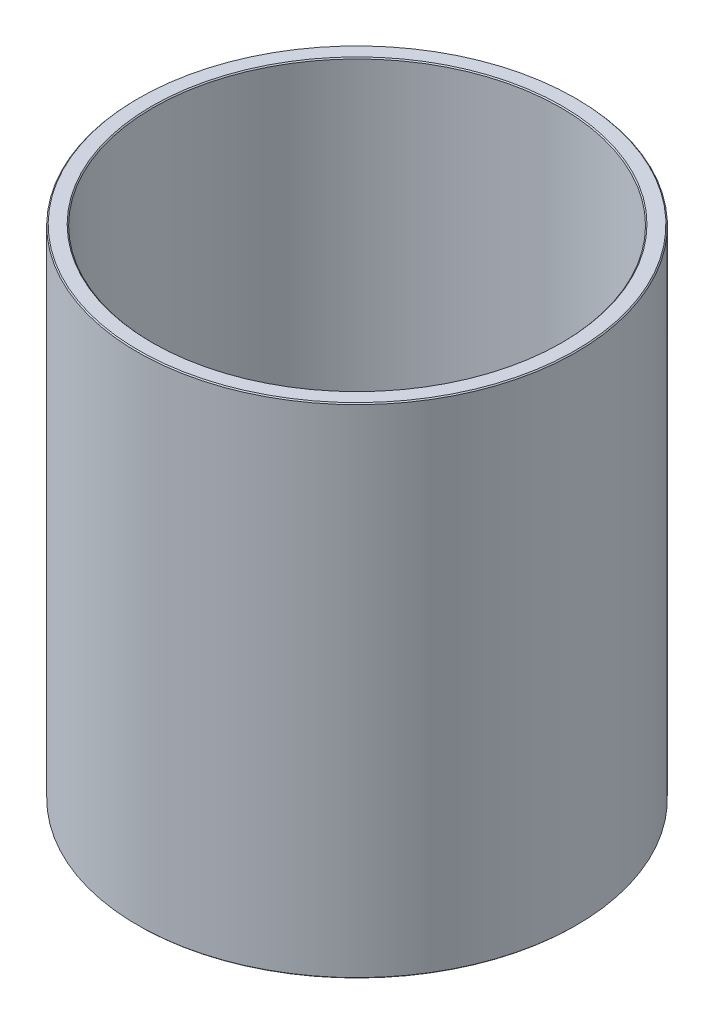
ISO-10303-21;
HEADER;
FILE_DESCRIPTION(('STEP AP214'),'2;1');
FILE_NAME('part.step','',(''),(''),'','','');
FILE_SCHEMA(('AUTOMOTIVE_DESIGN { 1 0 10303 214 1 1 1 1 }'));
ENDSEC;
DATA;
#1=APPLICATION_CONTEXT('core data for automotive mechanical design processes');
#2=APPLICATION_PROTOCOL_DEFINITION('international standard','automotive_design',2000,#1);
#3=PRODUCT_CONTEXT('',#1,'mechanical');
#4=PRODUCT('Part','Part','',(#3));
#5=PRODUCT_RELATED_PRODUCT_CATEGORY('part','',(#4));
#6=PRODUCT_DEFINITION_FORMATION('','',#4);
#7=PRODUCT_DEFINITION_CONTEXT('part definition',#1,'design');
#8=PRODUCT_DEFINITION('design','',#6,#7);
#9=PRODUCT_DEFINITION_SHAPE('','',#8);
#10=(LENGTH_UNIT() NAMED_UNIT(*) SI_UNIT(.MILLI.,.METRE.));
#11=(NAMED_UNIT(*) PLANE_ANGLE_UNIT() SI_UNIT($,.RADIAN.));
#12=(NAMED_UNIT(*) SI_UNIT($,.STERADIAN.) SOLID_ANGLE_UNIT());
#13=UNCERTAINTY_MEASURE_WITH_UNIT(LENGTH_MEASURE(1.E-05),#10,'distance_accuracy_value','');
#14=(GEOMETRIC_REPRESENTATION_CONTEXT(3) GLOBAL_UNCERTAINTY_ASSIGNED_CONTEXT((#13)) GLOBAL_UNIT_ASSIGNED_CONTEXT((#10,
#11,#12)) REPRESENTATION_CONTEXT('',''));
#15=CARTESIAN_POINT('',(0.,0.,0.));
#16=DIRECTION('',(0.,0.,1.));
#17=DIRECTION('',(1.,0.,0.));
#18=AXIS2_PLACEMENT_3D('',#15,#16,#17);
#19=CARTESIAN_POINT('',(39.5,0.,0.));
#20=DIRECTION('',(0.,-1.,0.));
#21=DIRECTION('',(0.,0.,-1.));
#22=AXIS2_PLACEMENT_3D('',#19,#20,#21);
#23=PLANE('',#22);
#24=CARTESIAN_POINT('',(0.,0.,0.));
#25=DIRECTION('',(0.,-1.,0.));
#26=DIRECTION('',(0.,0.,-1.));
#27=AXIS2_PLACEMENT_3D('',#24,#25,#26);
#28=CIRCLE('',#27,39.7);
#29=CARTESIAN_POINT('',(0.,0.,-39.7));
#30=VERTEX_POINT('',#29);
#31=EDGE_CURVE('E62',#30,#30,#28,.F.);
#32=ORIENTED_EDGE('',*,*,#31,.T.);
#33=EDGE_LOOP('',(#32));
#34=FACE_BOUND('',#33,.T.);
#35=CARTESIAN_POINT('',(0.,0.,0.));
#36=DIRECTION('',(0.,-1.,0.));
#37=DIRECTION('',(0.,0.,-1.));
#38=AXIS2_PLACEMENT_3D('',#35,#36,#37);
#39=CIRCLE('',#38,42.3);
#40=CARTESIAN_POINT('',(0.,0.,-42.3));
#41=VERTEX_POINT('',#40);
#42=EDGE_CURVE('E65',#41,#41,#39,.T.);
#43=ORIENTED_EDGE('',*,*,#42,.T.);
#44=EDGE_LOOP('',(#43));
#45=FACE_BOUND('',#44,.T.);
#46=ADVANCED_FACE('F41',(#34,#45),#23,.T.);
#47=CARTESIAN_POINT('',(0.,0.,0.));
#48=DIRECTION('',(0.,-1.,0.));
#49=DIRECTION('',(0.,0.,-1.));
#50=AXIS2_PLACEMENT_3D('',#47,#48,#49);
#51=CYLINDRICAL_SURFACE('',#50,42.5);
#52=CARTESIAN_POINT('',(0.,0.199999999999992,0.));
#53=DIRECTION('',(0.,-1.,0.));
#54=DIRECTION('',(0.,0.,-1.));
#55=AXIS2_PLACEMENT_3D('',#52,#53,#54);
#56=CIRCLE('',#55,42.5);
#57=CARTESIAN_POINT('',(0.,0.199999999999992,-42.5));
#58=VERTEX_POINT('',#57);
#59=EDGE_CURVE('E53',#58,#58,#56,.F.);
#60=ORIENTED_EDGE('',*,*,#59,.T.);
#61=EDGE_LOOP('',(#60));
#62=FACE_BOUND('',#61,.T.);
#63=CARTESIAN_POINT('',(0.,96.3000000000001,0.));
#64=DIRECTION('',(0.,1.,0.));
#65=DIRECTION('',(0.,0.,1.));
#66=AXIS2_PLACEMENT_3D('',#63,#64,#65);
#67=CIRCLE('',#66,42.5);
#68=CARTESIAN_POINT('',(0.,96.3000000000001,-42.5));
#69=VERTEX_POINT('',#68);
#70=EDGE_CURVE('E57',#69,#69,#67,.F.);
#71=ORIENTED_EDGE('',*,*,#70,.T.);
#72=EDGE_LOOP('',(#71));
#73=FACE_BOUND('',#72,.T.);
#74=ADVANCED_FACE('F91',(#62,#73),#51,.T.);
#75=CARTESIAN_POINT('',(42.5,96.5,0.));
#76=DIRECTION('',(0.,1.,0.));
#77=DIRECTION('',(0.,0.,1.));
#78=AXIS2_PLACEMENT_3D('',#75,#76,#77);
#79=PLANE('',#78);
#80=CARTESIAN_POINT('',(0.,96.5,0.));
#81=DIRECTION('',(0.,1.,0.));
#82=DIRECTION('',(0.,0.,1.));
#83=AXIS2_PLACEMENT_3D('',#80,#81,#82);
#84=CIRCLE('',#83,39.7);
#85=CARTESIAN_POINT('',(0.,96.5,39.7));
#86=VERTEX_POINT('',#85);
#87=EDGE_CURVE('E10',#86,#86,#84,.F.);
#88=ORIENTED_EDGE('',*,*,#87,.T.);
#89=EDGE_LOOP('',(#88));
#90=FACE_BOUND('',#89,.T.);
#91=CARTESIAN_POINT('',(0.,96.5,0.));
#92=DIRECTION('',(0.,1.,0.));
#93=DIRECTION('',(0.,0.,1.));
#94=AXIS2_PLACEMENT_3D('',#91,#92,#93);
#95=CIRCLE('',#94,42.3);
#96=CARTESIAN_POINT('',(0.,96.5,-42.3));
#97=VERTEX_POINT('',#96);
#98=EDGE_CURVE('E49',#97,#97,#95,.T.);
#99=ORIENTED_EDGE('',*,*,#98,.T.);
#100=EDGE_LOOP('',(#99));
#101=FACE_BOUND('',#100,.T.);
#102=ADVANCED_FACE('F97',(#90,#101),#79,.T.);
#103=CARTESIAN_POINT('',(0.,0.,0.));
#104=DIRECTION('',(0.,-1.,0.));
#105=DIRECTION('',(0.,0.,-1.));
#106=AXIS2_PLACEMENT_3D('',#103,#104,#105);
#107=CYLINDRICAL_SURFACE('',#106,39.5);
#108=CARTESIAN_POINT('',(0.,0.20000000000004,0.));
#109=DIRECTION('',(0.,-1.,0.));
#110=DIRECTION('',(0.,0.,-1.));
#111=AXIS2_PLACEMENT_3D('',#108,#109,#110);
#112=CIRCLE('',#111,39.5);
#113=CARTESIAN_POINT('',(0.,0.20000000000004,-39.5));
#114=VERTEX_POINT('',#113);
#115=EDGE_CURVE('E68',#114,#114,#112,.T.);
#116=ORIENTED_EDGE('',*,*,#115,.T.);
#117=EDGE_LOOP('',(#116));
#118=FACE_BOUND('',#117,.T.);
#119=CARTESIAN_POINT('',(0.,96.3,0.));
#120=DIRECTION('',(0.,1.,0.));
#121=DIRECTION('',(0.,0.,1.));
#122=AXIS2_PLACEMENT_3D('',#119,#120,#121);
#123=CIRCLE('',#122,39.5);
#124=CARTESIAN_POINT('',(0.,96.3,39.5));
#125=VERTEX_POINT('',#124);
#126=EDGE_CURVE('E71',#125,#125,#123,.T.);
#127=ORIENTED_EDGE('',*,*,#126,.T.);
#128=EDGE_LOOP('',(#127));
#129=FACE_BOUND('',#128,.T.);
#130=ADVANCED_FACE('F75',(#118,#129),#107,.F.);
#131=CARTESIAN_POINT('',(0.,0.20000000000004,0.));
#132=DIRECTION('',(0.,-1.,0.));
#133=DIRECTION('',(0.,0.,-1.));
#134=AXIS2_PLACEMENT_3D('',#131,#132,#133);
#135=CONICAL_SURFACE('',#134,39.5,0.785398163397466);
#136=ORIENTED_EDGE('',*,*,#31,.F.);
#137=EDGE_LOOP('',(#136));
#138=FACE_BOUND('',#137,.T.);
#139=ORIENTED_EDGE('',*,*,#115,.F.);
#140=EDGE_LOOP('',(#139));
#141=FACE_BOUND('',#140,.T.);
#142=ADVANCED_FACE('F86',(#138,#141),#135,.F.);
#143=CARTESIAN_POINT('',(0.,0.,0.));
#144=DIRECTION('',(0.,1.,0.));
#145=DIRECTION('',(0.,0.,1.));
#146=AXIS2_PLACEMENT_3D('',#143,#144,#145);
#147=CONICAL_SURFACE('',#146,42.3,0.785398163397431);
#148=ORIENTED_EDGE('',*,*,#59,.F.);
#149=EDGE_LOOP('',(#148));
#150=FACE_BOUND('',#149,.T.);
#151=ORIENTED_EDGE('',*,*,#42,.F.);
#152=EDGE_LOOP('',(#151));
#153=FACE_BOUND('',#152,.T.);
#154=ADVANCED_FACE('F80',(#150,#153),#147,.T.);
#155=CARTESIAN_POINT('',(0.,96.5,0.));
#156=DIRECTION('',(0.,1.,0.));
#157=DIRECTION('',(0.,0.,1.));
#158=AXIS2_PLACEMENT_3D('',#155,#156,#157);
#159=CONICAL_SURFACE('',#158,39.7,0.785398163397483);
#160=CARTESIAN_POINT('',(0.,96.3,39.5));
#161=CARTESIAN_POINT('',(0.,96.3020833333333,39.5020833333333));
#162=CARTESIAN_POINT('',(0.,96.3041666666667,39.5041666666667));
#163=CARTESIAN_POINT('',(0.,96.3083333333333,39.5083333333333));
#164=CARTESIAN_POINT('',(0.,96.3104166666667,39.5104166666667));
#165=CARTESIAN_POINT('',(0.,96.3145833333333,39.5145833333333));
#166=CARTESIAN_POINT('',(0.,96.3166666666667,39.5166666666667));
#167=CARTESIAN_POINT('',(0.,96.3208333333333,39.5208333333333));
#168=CARTESIAN_POINT('',(0.,96.3229166666667,39.5229166666667));
#169=CARTESIAN_POINT('',(0.,96.3270833333333,39.5270833333333));
#170=CARTESIAN_POINT('',(0.,96.3291666666667,39.5291666666666));
#171=CARTESIAN_POINT('',(0.,96.3333333333333,39.5333333333333));
#172=CARTESIAN_POINT('',(0.,96.3354166666667,39.5354166666666));
#173=CARTESIAN_POINT('',(0.,96.3395833333333,39.5395833333333));
#174=CARTESIAN_POINT('',(0.,96.3416666666667,39.5416666666667));
#175=CARTESIAN_POINT('',(0.,96.3458333333333,39.5458333333333));
#176=CARTESIAN_POINT('',(0.,96.3479166666667,39.5479166666666));
#177=CARTESIAN_POINT('',(0.,96.3520833333333,39.5520833333333));
#178=CARTESIAN_POINT('',(0.,96.3541666666667,39.5541666666667));
#179=CARTESIAN_POINT('',(0.,96.3583333333333,39.5583333333333));
#180=CARTESIAN_POINT('',(0.,96.3604166666667,39.5604166666667));
#181=CARTESIAN_POINT('',(0.,96.3645833333333,39.5645833333333));
#182=CARTESIAN_POINT('',(0.,96.3666666666667,39.5666666666667));
#183=CARTESIAN_POINT('',(0.,96.3708333333333,39.5708333333333));
#184=CARTESIAN_POINT('',(0.,96.3729166666667,39.5729166666667));
#185=CARTESIAN_POINT('',(0.,96.3770833333333,39.5770833333333));
#186=CARTESIAN_POINT('',(0.,96.3791666666667,39.5791666666667));
#187=CARTESIAN_POINT('',(0.,96.3833333333333,39.5833333333333));
#188=CARTESIAN_POINT('',(0.,96.3854166666667,39.5854166666667));
#189=CARTESIAN_POINT('',(0.,96.3895833333333,39.5895833333333));
#190=CARTESIAN_POINT('',(0.,96.3916666666667,39.5916666666666));
#191=CARTESIAN_POINT('',(0.,96.3958333333333,39.5958333333333));
#192=CARTESIAN_POINT('',(0.,96.3979166666667,39.5979166666666));
#193=CARTESIAN_POINT('',(0.,96.4020833333333,39.6020833333333));
#194=CARTESIAN_POINT('',(0.,96.4041666666667,39.6041666666667));
#195=CARTESIAN_POINT('',(0.,96.4083333333333,39.6083333333333));
#196=CARTESIAN_POINT('',(0.,96.4104166666667,39.6104166666667));
#197=CARTESIAN_POINT('',(0.,96.4145833333333,39.6145833333333));
#198=CARTESIAN_POINT('',(0.,96.4166666666667,39.6166666666666));
#199=CARTESIAN_POINT('',(0.,96.4208333333333,39.6208333333333));
#200=CARTESIAN_POINT('',(0.,96.4229166666667,39.6229166666666));
#201=CARTESIAN_POINT('',(0.,96.4270833333333,39.6270833333333));
#202=CARTESIAN_POINT('',(0.,96.4291666666667,39.6291666666666));
#203=CARTESIAN_POINT('',(0.,96.4333333333333,39.6333333333333));
#204=CARTESIAN_POINT('',(0.,96.4354166666667,39.6354166666666));
#205=CARTESIAN_POINT('',(0.,96.4395833333333,39.6395833333333));
#206=CARTESIAN_POINT('',(0.,96.4416666666667,39.6416666666666));
#207=CARTESIAN_POINT('',(0.,96.4458333333333,39.6458333333333));
#208=CARTESIAN_POINT('',(0.,96.4479166666667,39.6479166666666));
#209=CARTESIAN_POINT('',(0.,96.4520833333333,39.6520833333333));
#210=CARTESIAN_POINT('',(0.,96.4541666666667,39.6541666666666));
#211=CARTESIAN_POINT('',(0.,96.4583333333333,39.6583333333333));
#212=CARTESIAN_POINT('',(0.,96.4604166666667,39.6604166666666));
#213=CARTESIAN_POINT('',(0.,96.4645833333333,39.6645833333333));
#214=CARTESIAN_POINT('',(0.,96.4666666666667,39.6666666666667));
#215=CARTESIAN_POINT('',(0.,96.4708333333333,39.6708333333333));
#216=CARTESIAN_POINT('',(0.,96.4729166666667,39.6729166666667));
#217=CARTESIAN_POINT('',(0.,96.4770833333333,39.6770833333333));
#218=CARTESIAN_POINT('',(0.,96.4791666666667,39.6791666666666));
#219=CARTESIAN_POINT('',(0.,96.4833333333333,39.6833333333333));
#220=CARTESIAN_POINT('',(0.,96.4854166666667,39.6854166666666));
#221=CARTESIAN_POINT('',(0.,96.4895833333333,39.6895833333333));
#222=CARTESIAN_POINT('',(0.,96.4916666666667,39.6916666666666));
#223=CARTESIAN_POINT('',(0.,96.4958333333333,39.6958333333333));
#224=CARTESIAN_POINT('',(0.,96.4979166666667,39.6979166666666));
#225=CARTESIAN_POINT('',(0.,96.5,39.7));
#226=B_SPLINE_CURVE_WITH_KNOTS('',3,(#160,#161,#162,#163,#164,#165,#166,#167,#168,#169,#170,
#171,#172,#173,#174,#175,#176,#177,#178,#179,#180,#181,#182,#183,#184,#185,#186,#187,#188,#189,
#190,#191,#192,#193,#194,#195,#196,#197,#198,#199,#200,#201,#202,#203,#204,#205,#206,#207,#208,
#209,#210,#211,#212,#213,#214,#215,#216,#217,#218,#219,#220,#221,#222,#223,#224,#225),
.UNSPECIFIED.,.F.,.F.,(4,2,2,2,2,2,2,2,2,2,2,2,2,2,2,2,2,2,2,2,2,2,2,2,2,2,2,2,2,2,2,2,4),(0.,
0.00883883476483087,0.0176776695296617,0.0265165042944926,0.0353553390593235,0.0441941738241543,
0.0530330085889852,0.0618718433538161,0.070710678118647,0.0795495128834827,0.0883883476483136,
0.0972271824131445,0.106066017177985,0.114904851942806,0.123743686707637,0.132582521472468,
0.141421356237299,0.15026019100213,0.159099025766961,0.167937860531791,0.176776695296622,
0.185615530061453,0.194454364826284,0.203293199591115,0.212132034355956,0.220970869120791,
0.229809703885622,0.238648538650453,0.247487373415284,0.256326208180115,0.265165042944946,
0.274003877709777,0.282842712474608),.UNSPECIFIED.);
#227=EDGE_CURVE('BSEAM77',#125,#86,#226,.T.);
#228=ORIENTED_EDGE('',*,*,#126,.F.);
#229=ORIENTED_EDGE('',*,*,#87,.F.);
#230=ORIENTED_EDGE('',*,*,#227,.T.);
#231=ORIENTED_EDGE('',*,*,#227,.F.);
#232=EDGE_LOOP('',(#228,#230,#229,#231));
#233=FACE_BOUND('',#232,.T.);
#234=ADVANCED_FACE('F77',(#233),#159,.F.);
#235=CARTESIAN_POINT('',(0.,96.3000000000001,0.));
#236=DIRECTION('',(0.,-1.,0.));
#237=DIRECTION('',(0.,0.,-1.));
#238=AXIS2_PLACEMENT_3D('',#235,#236,#237);
#239=CONICAL_SURFACE('',#238,42.5,0.785398163397535);
#240=CARTESIAN_POINT('',(0.,96.5,-42.3));
#241=CARTESIAN_POINT('',(0.,96.4979166666667,-42.3020833333334));
#242=CARTESIAN_POINT('',(0.,96.4958333333333,-42.3041666666667));
#243=CARTESIAN_POINT('',(0.,96.4916666666667,-42.3083333333334));
#244=CARTESIAN_POINT('',(0.,96.4895833333333,-42.3104166666667));
#245=CARTESIAN_POINT('',(0.,96.4854166666667,-42.3145833333334));
#246=CARTESIAN_POINT('',(0.,96.4833333333333,-42.3166666666667));
#247=CARTESIAN_POINT('',(0.,96.4791666666667,-42.3208333333334));
#248=CARTESIAN_POINT('',(0.,96.4770833333333,-42.3229166666667));
#249=CARTESIAN_POINT('',(0.,96.4729166666667,-42.3270833333334));
#250=CARTESIAN_POINT('',(0.,96.4708333333333,-42.3291666666667));
#251=CARTESIAN_POINT('',(0.,96.4666666666667,-42.3333333333334));
#252=CARTESIAN_POINT('',(0.,96.4645833333333,-42.3354166666667));
#253=CARTESIAN_POINT('',(0.,96.4604166666667,-42.3395833333334));
#254=CARTESIAN_POINT('',(0.,96.4583333333333,-42.3416666666667));
#255=CARTESIAN_POINT('',(0.,96.4541666666667,-42.3458333333334));
#256=CARTESIAN_POINT('',(0.,96.4520833333333,-42.3479166666667));
#257=CARTESIAN_POINT('',(0.,96.4479166666667,-42.3520833333334));
#258=CARTESIAN_POINT('',(0.,96.4458333333333,-42.3541666666667));
#259=CARTESIAN_POINT('',(0.,96.4416666666667,-42.3583333333333));
#260=CARTESIAN_POINT('',(0.,96.4395833333333,-42.3604166666667));
#261=CARTESIAN_POINT('',(0.,96.4354166666667,-42.3645833333333));
#262=CARTESIAN_POINT('',(0.,96.4333333333333,-42.3666666666667));
#263=CARTESIAN_POINT('',(0.,96.4291666666667,-42.3708333333334));
#264=CARTESIAN_POINT('',(0.,96.4270833333333,-42.3729166666667));
#265=CARTESIAN_POINT('',(0.,96.4229166666667,-42.3770833333334));
#266=CARTESIAN_POINT('',(0.,96.4208333333333,-42.3791666666667));
#267=CARTESIAN_POINT('',(0.,96.4166666666667,-42.3833333333333));
#268=CARTESIAN_POINT('',(0.,96.4145833333333,-42.3854166666667));
#269=CARTESIAN_POINT('',(0.,96.4104166666667,-42.3895833333333));
#270=CARTESIAN_POINT('',(0.,96.4083333333333,-42.3916666666667));
#271=CARTESIAN_POINT('',(0.,96.4041666666667,-42.3958333333333));
#272=CARTESIAN_POINT('',(0.,96.4020833333334,-42.3979166666667));
#273=CARTESIAN_POINT('',(0.,96.3979166666667,-42.4020833333334));
#274=CARTESIAN_POINT('',(0.,96.3958333333334,-42.4041666666667));
#275=CARTESIAN_POINT('',(0.,96.3916666666667,-42.4083333333334));
#276=CARTESIAN_POINT('',(0.,96.3895833333334,-42.4104166666667));
#277=CARTESIAN_POINT('',(0.,96.3854166666667,-42.4145833333334));
#278=CARTESIAN_POINT('',(0.,96.3833333333334,-42.4166666666667));
#279=CARTESIAN_POINT('',(0.,96.3791666666667,-42.4208333333333));
#280=CARTESIAN_POINT('',(0.,96.3770833333334,-42.4229166666667));
#281=CARTESIAN_POINT('',(0.,96.3729166666667,-42.4270833333333));
#282=CARTESIAN_POINT('',(0.,96.3708333333334,-42.4291666666667));
#283=CARTESIAN_POINT('',(0.,96.3666666666667,-42.4333333333334));
#284=CARTESIAN_POINT('',(0.,96.3645833333334,-42.4354166666667));
#285=CARTESIAN_POINT('',(0.,96.3604166666667,-42.4395833333334));
#286=CARTESIAN_POINT('',(0.,96.3583333333334,-42.4416666666667));
#287=CARTESIAN_POINT('',(0.,96.3541666666667,-42.4458333333333));
#288=CARTESIAN_POINT('',(0.,96.3520833333334,-42.4479166666667));
#289=CARTESIAN_POINT('',(0.,96.3479166666667,-42.4520833333333));
#290=CARTESIAN_POINT('',(0.,96.3458333333334,-42.4541666666667));
#291=CARTESIAN_POINT('',(0.,96.3416666666667,-42.4583333333333));
#292=CARTESIAN_POINT('',(0.,96.3395833333334,-42.4604166666667));
#293=CARTESIAN_POINT('',(0.,96.3354166666667,-42.4645833333333));
#294=CARTESIAN_POINT('',(0.,96.3333333333334,-42.4666666666667));
#295=CARTESIAN_POINT('',(0.,96.3291666666667,-42.4708333333333));
#296=CARTESIAN_POINT('',(0.,96.3270833333334,-42.4729166666667));
#297=CARTESIAN_POINT('',(0.,96.3229166666667,-42.4770833333333));
#298=CARTESIAN_POINT('',(0.,96.3208333333334,-42.4791666666667));
#299=CARTESIAN_POINT('',(0.,96.3166666666667,-42.4833333333333));
#300=CARTESIAN_POINT('',(0.,96.3145833333334,-42.4854166666667));
#301=CARTESIAN_POINT('',(0.,96.3104166666667,-42.4895833333333));
#302=CARTESIAN_POINT('',(0.,96.3083333333334,-42.4916666666667));
#303=CARTESIAN_POINT('',(0.,96.3041666666667,-42.4958333333333));
#304=CARTESIAN_POINT('',(0.,96.3020833333334,-42.4979166666667));
#305=CARTESIAN_POINT('',(0.,96.3000000000001,-42.5));
#306=B_SPLINE_CURVE_WITH_KNOTS('',3,(#240,#241,#242,#243,#244,#245,#246,#247,#248,#249,#250,
#251,#252,#253,#254,#255,#256,#257,#258,#259,#260,#261,#262,#263,#264,#265,#266,#267,#268,#269,
#270,#271,#272,#273,#274,#275,#276,#277,#278,#279,#280,#281,#282,#283,#284,#285,#286,#287,#288,
#289,#290,#291,#292,#293,#294,#295,#296,#297,#298,#299,#300,#301,#302,#303,#304,#305),
.UNSPECIFIED.,.F.,.F.,(4,2,2,2,2,2,2,2,2,2,2,2,2,2,2,2,2,2,2,2,2,2,2,2,2,2,2,2,2,2,2,2,4),(0.,
0.00883883476482106,0.0176776695296519,0.0265165042944828,0.0353553390593137,0.0441941738241445,
0.0530330085889754,0.0618718433538063,0.0707106781186371,0.079549512883468,0.0883883476482989,
0.0972271824131297,0.106066017177961,0.114904851942791,0.123743686707622,0.132582521472453,
0.141421356237289,0.15026019100211,0.159099025766941,0.167937860531772,0.176776695296603,
0.185615530061434,0.194454364826264,0.203293199591095,0.212132034355926,0.220970869120757,
0.229809703885588,0.238648538650419,0.24748737341525,0.256326208180081,0.265165042944911,
0.274003877709742,0.282842712474563),.UNSPECIFIED.);
#307=EDGE_CURVE('BSEAM44',#97,#69,#306,.T.);
#308=ORIENTED_EDGE('',*,*,#98,.F.);
#309=ORIENTED_EDGE('',*,*,#70,.F.);
#310=ORIENTED_EDGE('',*,*,#307,.T.);
#311=ORIENTED_EDGE('',*,*,#307,.F.);
#312=EDGE_LOOP('',(#308,#310,#309,#311));
#313=FACE_BOUND('',#312,.T.);
#314=ADVANCED_FACE('F44',(#313),#239,.T.);
#315=CLOSED_SHELL('',(#46,#74,#102,#130,#142,#154,#234,#314));
#316=MANIFOLD_SOLID_BREP('B2',#315);
#317=ADVANCED_BREP_SHAPE_REPRESENTATION('',(#18,#316),#14);
#318=SHAPE_DEFINITION_REPRESENTATION(#9,#317);
ENDSEC;
END-ISO-10303-21;
